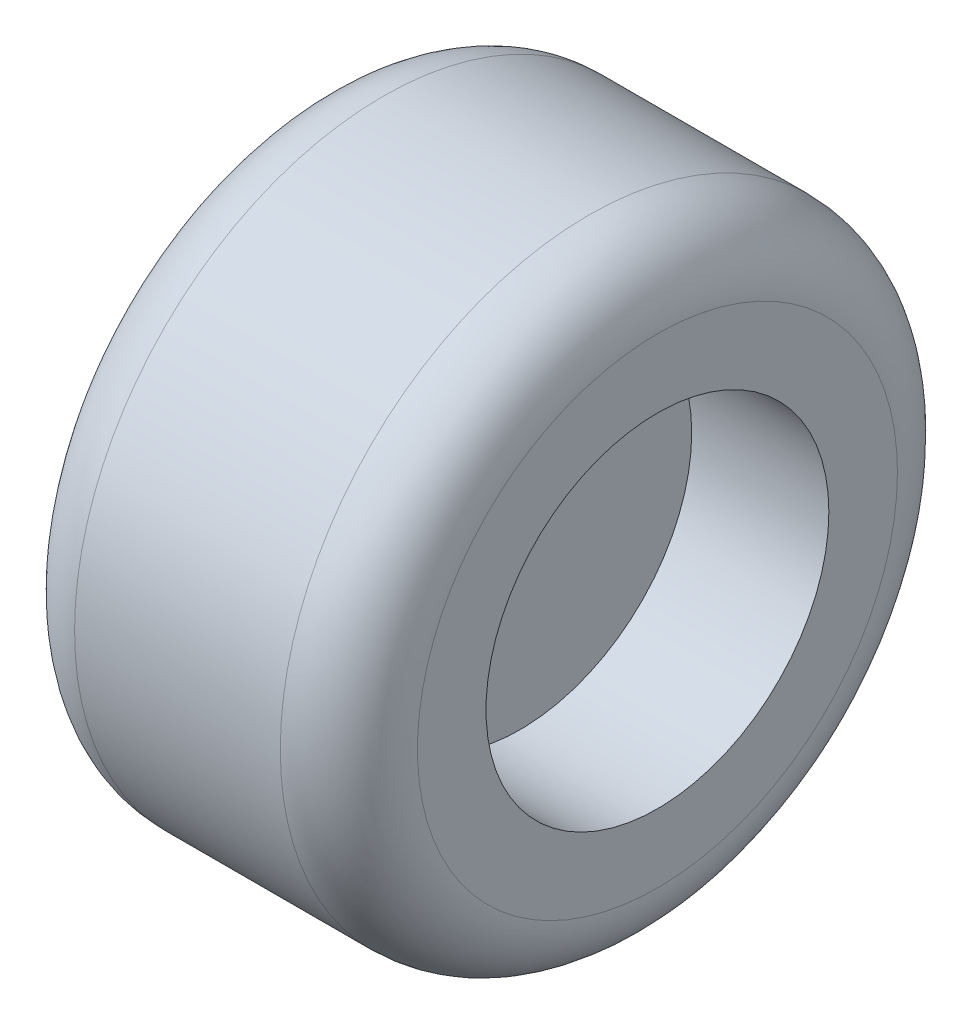
ISO-10303-21;
HEADER;
FILE_DESCRIPTION(('STEP AP214'),'2;1');
FILE_NAME('part.step','',(''),(''),'','','');
FILE_SCHEMA(('AUTOMOTIVE_DESIGN { 1 0 10303 214 1 1 1 1 }'));
ENDSEC;
DATA;
#1=APPLICATION_CONTEXT('core data for automotive mechanical design processes');
#2=APPLICATION_PROTOCOL_DEFINITION('international standard','automotive_design',2000,#1);
#3=PRODUCT_CONTEXT('',#1,'mechanical');
#4=PRODUCT('Part','Part','',(#3));
#5=PRODUCT_RELATED_PRODUCT_CATEGORY('part','',(#4));
#6=PRODUCT_DEFINITION_FORMATION('','',#4);
#7=PRODUCT_DEFINITION_CONTEXT('part definition',#1,'design');
#8=PRODUCT_DEFINITION('design','',#6,#7);
#9=PRODUCT_DEFINITION_SHAPE('','',#8);
#10=(LENGTH_UNIT() NAMED_UNIT(*) SI_UNIT(.MILLI.,.METRE.));
#11=(NAMED_UNIT(*) PLANE_ANGLE_UNIT() SI_UNIT($,.RADIAN.));
#12=(NAMED_UNIT(*) SI_UNIT($,.STERADIAN.) SOLID_ANGLE_UNIT());
#13=UNCERTAINTY_MEASURE_WITH_UNIT(LENGTH_MEASURE(1.E-05),#10,'distance_accuracy_value','');
#14=(GEOMETRIC_REPRESENTATION_CONTEXT(3) GLOBAL_UNCERTAINTY_ASSIGNED_CONTEXT((#13)) GLOBAL_UNIT_ASSIGNED_CONTEXT((#10,
#11,#12)) REPRESENTATION_CONTEXT('',''));
#15=CARTESIAN_POINT('',(0.,0.,0.));
#16=DIRECTION('',(0.,0.,1.));
#17=DIRECTION('',(1.,0.,0.));
#18=AXIS2_PLACEMENT_3D('',#15,#16,#17);
#19=CARTESIAN_POINT('',(25.,0.,0.));
#20=DIRECTION('',(-1.,0.,0.));
#21=DIRECTION('',(0.,0.,1.));
#22=AXIS2_PLACEMENT_3D('',#19,#20,#21);
#23=CYLINDRICAL_SURFACE('',#22,22.5);
#24=CARTESIAN_POINT('',(5.,0.,0.));
#25=DIRECTION('',(1.,0.,0.));
#26=DIRECTION('',(0.,0.,-1.));
#27=AXIS2_PLACEMENT_3D('',#24,#25,#26);
#28=CIRCLE('',#27,22.5);
#29=CARTESIAN_POINT('',(5.,0.,-22.5));
#30=VERTEX_POINT('',#29);
#31=EDGE_CURVE('E43',#30,#30,#28,.T.);
#32=ORIENTED_EDGE('',*,*,#31,.T.);
#33=EDGE_LOOP('',(#32));
#34=FACE_BOUND('',#33,.T.);
#35=CARTESIAN_POINT('',(20.,0.,0.));
#36=DIRECTION('',(1.,0.,0.));
#37=DIRECTION('',(0.,0.,-1.));
#38=AXIS2_PLACEMENT_3D('',#35,#36,#37);
#39=CIRCLE('',#38,22.5);
#40=CARTESIAN_POINT('',(20.,0.,-22.5));
#41=VERTEX_POINT('',#40);
#42=EDGE_CURVE('E48',#41,#41,#39,.F.);
#43=ORIENTED_EDGE('',*,*,#42,.T.);
#44=EDGE_LOOP('',(#43));
#45=FACE_BOUND('',#44,.T.);
#46=ADVANCED_FACE('F31',(#34,#45),#23,.T.);
#47=CARTESIAN_POINT('',(25.,0.,0.));
#48=DIRECTION('',(1.,0.,0.));
#49=DIRECTION('',(0.,0.,-1.));
#50=AXIS2_PLACEMENT_3D('',#47,#48,#49);
#51=PLANE('',#50);
#52=CARTESIAN_POINT('',(25.,0.,0.));
#53=DIRECTION('',(1.,0.,0.));
#54=DIRECTION('',(0.,0.,-1.));
#55=AXIS2_PLACEMENT_3D('',#52,#53,#54);
#56=CIRCLE('',#55,17.5);
#57=CARTESIAN_POINT('',(25.,0.,-17.5));
#58=VERTEX_POINT('',#57);
#59=EDGE_CURVE('E10',#58,#58,#56,.T.);
#60=ORIENTED_EDGE('',*,*,#59,.T.);
#61=EDGE_LOOP('',(#60));
#62=FACE_BOUND('',#61,.T.);
#63=CARTESIAN_POINT('',(25.,0.,0.));
#64=DIRECTION('',(1.,0.,0.));
#65=DIRECTION('',(0.,0.,-1.));
#66=AXIS2_PLACEMENT_3D('',#63,#64,#65);
#67=CIRCLE('',#66,12.5);
#68=CARTESIAN_POINT('',(25.,0.,-12.5));
#69=VERTEX_POINT('',#68);
#70=EDGE_CURVE('E52',#69,#69,#67,.T.);
#71=ORIENTED_EDGE('',*,*,#70,.F.);
#72=EDGE_LOOP('',(#71));
#73=FACE_BOUND('',#72,.T.);
#74=ADVANCED_FACE('F80',(#62,#73),#51,.T.);
#75=CARTESIAN_POINT('',(0.,0.,0.));
#76=DIRECTION('',(1.,0.,0.));
#77=DIRECTION('',(0.,0.,-1.));
#78=AXIS2_PLACEMENT_3D('',#75,#76,#77);
#79=PLANE('',#78);
#80=CARTESIAN_POINT('',(0.,0.,0.));
#81=DIRECTION('',(-1.,0.,0.));
#82=DIRECTION('',(0.,0.,1.));
#83=AXIS2_PLACEMENT_3D('',#80,#81,#82);
#84=CIRCLE('',#83,1.5);
#85=CARTESIAN_POINT('',(0.,0.,1.5));
#86=VERTEX_POINT('',#85);
#87=EDGE_CURVE('E57',#86,#86,#84,.T.);
#88=ORIENTED_EDGE('',*,*,#87,.F.);
#89=EDGE_LOOP('',(#88));
#90=FACE_BOUND('',#89,.T.);
#91=CARTESIAN_POINT('',(0.,0.,0.));
#92=DIRECTION('',(1.,0.,0.));
#93=DIRECTION('',(0.,0.,-1.));
#94=AXIS2_PLACEMENT_3D('',#91,#92,#93);
#95=CIRCLE('',#94,17.5);
#96=CARTESIAN_POINT('',(0.,0.,-17.5));
#97=VERTEX_POINT('',#96);
#98=EDGE_CURVE('E39',#97,#97,#95,.F.);
#99=ORIENTED_EDGE('',*,*,#98,.T.);
#100=EDGE_LOOP('',(#99));
#101=FACE_BOUND('',#100,.T.);
#102=ADVANCED_FACE('F76',(#90,#101),#79,.F.);
#103=CARTESIAN_POINT('',(15.,0.,0.));
#104=DIRECTION('',(1.,0.,0.));
#105=DIRECTION('',(0.,0.,-1.));
#106=AXIS2_PLACEMENT_3D('',#103,#104,#105);
#107=CYLINDRICAL_SURFACE('',#106,12.5);
#108=CARTESIAN_POINT('',(15.,0.,0.));
#109=DIRECTION('',(1.,0.,0.));
#110=DIRECTION('',(0.,0.,-1.));
#111=AXIS2_PLACEMENT_3D('',#108,#109,#110);
#112=CIRCLE('',#111,12.5);
#113=CARTESIAN_POINT('',(15.,0.,-12.5));
#114=VERTEX_POINT('',#113);
#115=EDGE_CURVE('E51',#114,#114,#112,.T.);
#116=ORIENTED_EDGE('',*,*,#115,.F.);
#117=EDGE_LOOP('',(#116));
#118=FACE_BOUND('',#117,.T.);
#119=ORIENTED_EDGE('',*,*,#70,.T.);
#120=EDGE_LOOP('',(#119));
#121=FACE_BOUND('',#120,.T.);
#122=ADVANCED_FACE('F70',(#118,#121),#107,.F.);
#123=CARTESIAN_POINT('',(15.,0.,0.));
#124=DIRECTION('',(1.,0.,0.));
#125=DIRECTION('',(0.,0.,-1.));
#126=AXIS2_PLACEMENT_3D('',#123,#124,#125);
#127=PLANE('',#126);
#128=CARTESIAN_POINT('',(15.,0.,0.));
#129=DIRECTION('',(1.,0.,0.));
#130=DIRECTION('',(0.,0.,-1.));
#131=AXIS2_PLACEMENT_3D('',#128,#129,#130);
#132=CIRCLE('',#131,1.5);
#133=CARTESIAN_POINT('',(15.,0.,-1.5));
#134=VERTEX_POINT('',#133);
#135=EDGE_CURVE('E35',#134,#134,#132,.T.);
#136=ORIENTED_EDGE('',*,*,#135,.F.);
#137=EDGE_LOOP('',(#136));
#138=FACE_BOUND('',#137,.T.);
#139=ORIENTED_EDGE('',*,*,#115,.T.);
#140=EDGE_LOOP('',(#139));
#141=FACE_BOUND('',#140,.T.);
#142=ADVANCED_FACE('F66',(#138,#141),#127,.T.);
#143=CARTESIAN_POINT('',(5.,0.,0.));
#144=DIRECTION('',(1.,0.,0.));
#145=DIRECTION('',(0.,0.,-1.));
#146=AXIS2_PLACEMENT_3D('',#143,#144,#145);
#147=TOROIDAL_SURFACE('',#146,17.5,5.);
#148=ORIENTED_EDGE('',*,*,#98,.F.);
#149=EDGE_LOOP('',(#148));
#150=FACE_BOUND('',#149,.T.);
#151=ORIENTED_EDGE('',*,*,#31,.F.);
#152=EDGE_LOOP('',(#151));
#153=FACE_BOUND('',#152,.T.);
#154=ADVANCED_FACE('F69',(#150,#153),#147,.T.);
#155=CARTESIAN_POINT('',(20.,0.,0.));
#156=DIRECTION('',(1.,0.,0.));
#157=DIRECTION('',(0.,0.,-1.));
#158=AXIS2_PLACEMENT_3D('',#155,#156,#157);
#159=TOROIDAL_SURFACE('',#158,17.5,5.);
#160=ORIENTED_EDGE('',*,*,#42,.F.);
#161=EDGE_LOOP('',(#160));
#162=FACE_BOUND('',#161,.T.);
#163=ORIENTED_EDGE('',*,*,#59,.F.);
#164=EDGE_LOOP('',(#163));
#165=FACE_BOUND('',#164,.T.);
#166=ADVANCED_FACE('F33',(#162,#165),#159,.T.);
#167=CARTESIAN_POINT('',(25.,0.,0.));
#168=DIRECTION('',(-1.,0.,0.));
#169=DIRECTION('',(0.,0.,1.));
#170=AXIS2_PLACEMENT_3D('',#167,#168,#169);
#171=CYLINDRICAL_SURFACE('',#170,1.5);
#172=ORIENTED_EDGE('',*,*,#135,.T.);
#173=EDGE_LOOP('',(#172));
#174=FACE_BOUND('',#173,.T.);
#175=ORIENTED_EDGE('',*,*,#87,.T.);
#176=EDGE_LOOP('',(#175));
#177=FACE_BOUND('',#176,.T.);
#178=ADVANCED_FACE('F64',(#174,#177),#171,.F.);
#179=CLOSED_SHELL('',(#46,#74,#102,#122,#142,#154,#166,#178));
#180=MANIFOLD_SOLID_BREP('B2',#179);
#181=ADVANCED_BREP_SHAPE_REPRESENTATION('',(#18,#180),#14);
#182=SHAPE_DEFINITION_REPRESENTATION(#9,#181);
ENDSEC;
END-ISO-10303-21;
